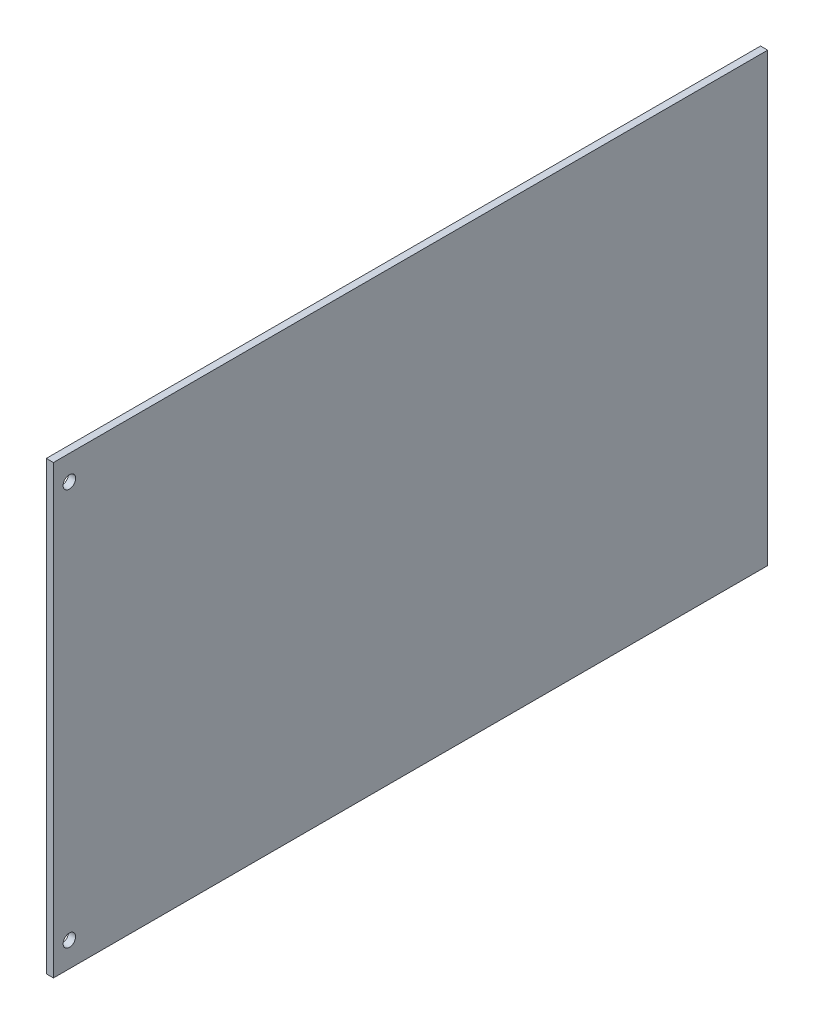
ISO-10303-21;
HEADER;
FILE_DESCRIPTION(('STEP AP214'),'2;1');
FILE_NAME('part.step','',(''),(''),'','','');
FILE_SCHEMA(('AUTOMOTIVE_DESIGN { 1 0 10303 214 1 1 1 1 }'));
ENDSEC;
DATA;
#1=APPLICATION_CONTEXT('core data for automotive mechanical design processes');
#2=APPLICATION_PROTOCOL_DEFINITION('international standard','automotive_design',2000,#1);
#3=PRODUCT_CONTEXT('',#1,'mechanical');
#4=PRODUCT('Part','Part','',(#3));
#5=PRODUCT_RELATED_PRODUCT_CATEGORY('part','',(#4));
#6=PRODUCT_DEFINITION_FORMATION('','',#4);
#7=PRODUCT_DEFINITION_CONTEXT('part definition',#1,'design');
#8=PRODUCT_DEFINITION('design','',#6,#7);
#9=PRODUCT_DEFINITION_SHAPE('','',#8);
#10=(LENGTH_UNIT() NAMED_UNIT(*) SI_UNIT(.MILLI.,.METRE.));
#11=(NAMED_UNIT(*) PLANE_ANGLE_UNIT() SI_UNIT($,.RADIAN.));
#12=(NAMED_UNIT(*) SI_UNIT($,.STERADIAN.) SOLID_ANGLE_UNIT());
#13=UNCERTAINTY_MEASURE_WITH_UNIT(LENGTH_MEASURE(1.E-05),#10,'distance_accuracy_value','');
#14=(GEOMETRIC_REPRESENTATION_CONTEXT(3) GLOBAL_UNCERTAINTY_ASSIGNED_CONTEXT((#13)) GLOBAL_UNIT_ASSIGNED_CONTEXT((#10,
#11,#12)) REPRESENTATION_CONTEXT('',''));
#15=CARTESIAN_POINT('',(0.,0.,0.));
#16=DIRECTION('',(0.,0.,1.));
#17=DIRECTION('',(1.,0.,0.));
#18=AXIS2_PLACEMENT_3D('',#15,#16,#17);
#19=CARTESIAN_POINT('',(-3.62,11.200000000001,-162.53));
#20=DIRECTION('',(1.,0.,0.));
#21=DIRECTION('',(0.,0.,-1.));
#22=AXIS2_PLACEMENT_3D('',#19,#20,#21);
#23=PLANE('',#22);
#24=CARTESIAN_POINT('',(-3.62,16.750000000001,-6.09999999999955));
#25=DIRECTION('',(-1.,0.,0.));
#26=DIRECTION('',(0.,0.,1.));
#27=AXIS2_PLACEMENT_3D('',#24,#25,#26);
#28=CIRCLE('',#27,1.4);
#29=CARTESIAN_POINT('',(-3.62,16.750000000001,-4.69999999999956));
#30=VERTEX_POINT('',#29);
#31=EDGE_CURVE('E84',#30,#30,#28,.T.);
#32=ORIENTED_EDGE('',*,*,#31,.T.);
#33=EDGE_LOOP('',(#32));
#34=FACE_BOUND('',#33,.T.);
#35=CARTESIAN_POINT('',(-3.62,105.650000000001,-6.09999999999955));
#36=DIRECTION('',(-1.,0.,0.));
#37=DIRECTION('',(0.,0.,1.));
#38=AXIS2_PLACEMENT_3D('',#35,#36,#37);
#39=CIRCLE('',#38,1.4);
#40=CARTESIAN_POINT('',(-3.62,105.650000000001,-4.69999999999956));
#41=VERTEX_POINT('',#40);
#42=EDGE_CURVE('E19',#41,#41,#39,.T.);
#43=ORIENTED_EDGE('',*,*,#42,.T.);
#44=EDGE_LOOP('',(#43));
#45=FACE_BOUND('',#44,.T.);
#46=DIRECTION('',(0.,-1.,0.));
#47=VECTOR('',#46,1.);
#48=CARTESIAN_POINT('',(-3.62,111.200000000001,-2.52999999999955));
#49=LINE('',#48,#47);
#50=CARTESIAN_POINT('',(-3.62,11.200000000001,-2.52999999999955));
#51=VERTEX_POINT('',#50);
#52=CARTESIAN_POINT('',(-3.62,111.200000000001,-2.52999999999954));
#53=VERTEX_POINT('',#52);
#54=EDGE_CURVE('E58',#51,#53,#49,.F.);
#55=ORIENTED_EDGE('',*,*,#54,.F.);
#56=DIRECTION('',(0.,0.,-1.));
#57=VECTOR('',#56,1.);
#58=CARTESIAN_POINT('',(-3.62,11.200000000001,-2.52999999999956));
#59=LINE('',#58,#57);
#60=CARTESIAN_POINT('',(-3.62,11.200000000001,-162.53));
#61=VERTEX_POINT('',#60);
#62=EDGE_CURVE('E53',#61,#51,#59,.F.);
#63=ORIENTED_EDGE('',*,*,#62,.F.);
#64=DIRECTION('',(0.,1.,0.));
#65=VECTOR('',#64,1.);
#66=CARTESIAN_POINT('',(-3.62,111.200000000001,-162.53));
#67=LINE('',#66,#65);
#68=CARTESIAN_POINT('',(-3.62,111.200000000001,-162.53));
#69=VERTEX_POINT('',#68);
#70=EDGE_CURVE('E70',#69,#61,#67,.F.);
#71=ORIENTED_EDGE('',*,*,#70,.F.);
#72=DIRECTION('',(0.,0.,1.));
#73=VECTOR('',#72,1.);
#74=CARTESIAN_POINT('',(-3.62,111.200000000001,-2.52999999999955));
#75=LINE('',#74,#73);
#76=EDGE_CURVE('E67',#53,#69,#75,.F.);
#77=ORIENTED_EDGE('',*,*,#76,.F.);
#78=EDGE_LOOP('',(#55,#63,#71,#77));
#79=FACE_BOUND('',#78,.T.);
#80=ADVANCED_FACE('F16',(#34,#45,#79),#23,.T.);
#81=CARTESIAN_POINT('',(-5.22,111.200000000001,-2.52999999999955));
#82=DIRECTION('',(0.,1.,0.));
#83=DIRECTION('',(0.,0.,1.));
#84=AXIS2_PLACEMENT_3D('',#81,#82,#83);
#85=PLANE('',#84);
#86=DIRECTION('',(0.,0.,-1.));
#87=VECTOR('',#86,1.);
#88=CARTESIAN_POINT('',(-5.22,111.200000000001,-162.53));
#89=LINE('',#88,#87);
#90=CARTESIAN_POINT('',(-5.22,111.200000000001,-162.53));
#91=VERTEX_POINT('',#90);
#92=CARTESIAN_POINT('',(-5.22,111.200000000001,-2.52999999999954));
#93=VERTEX_POINT('',#92);
#94=EDGE_CURVE('E77',#91,#93,#89,.F.);
#95=ORIENTED_EDGE('',*,*,#94,.T.);
#96=DIRECTION('',(1.,0.,0.));
#97=VECTOR('',#96,1.);
#98=CARTESIAN_POINT('',(-5.22,111.200000000001,-2.52999999999955));
#99=LINE('',#98,#97);
#100=EDGE_CURVE('E63',#53,#93,#99,.F.);
#101=ORIENTED_EDGE('',*,*,#100,.F.);
#102=ORIENTED_EDGE('',*,*,#76,.T.);
#103=DIRECTION('',(-1.,0.,0.));
#104=VECTOR('',#103,1.);
#105=CARTESIAN_POINT('',(-5.22,111.200000000001,-162.53));
#106=LINE('',#105,#104);
#107=EDGE_CURVE('E91',#91,#69,#106,.F.);
#108=ORIENTED_EDGE('',*,*,#107,.F.);
#109=EDGE_LOOP('',(#95,#101,#102,#108));
#110=FACE_BOUND('',#109,.T.);
#111=ADVANCED_FACE('F76',(#110),#85,.T.);
#112=CARTESIAN_POINT('',(-5.22,111.200000000001,-2.52999999999955));
#113=DIRECTION('',(0.,0.,1.));
#114=DIRECTION('',(0.,-1.,0.));
#115=AXIS2_PLACEMENT_3D('',#112,#113,#114);
#116=PLANE('',#115);
#117=DIRECTION('',(0.,1.,0.));
#118=VECTOR('',#117,1.);
#119=CARTESIAN_POINT('',(-5.22,11.200000000001,-2.52999999999953));
#120=LINE('',#119,#118);
#121=CARTESIAN_POINT('',(-5.22,11.200000000001,-2.52999999999955));
#122=VERTEX_POINT('',#121);
#123=EDGE_CURVE('E88',#93,#122,#120,.F.);
#124=ORIENTED_EDGE('',*,*,#123,.T.);
#125=DIRECTION('',(1.,0.,0.));
#126=VECTOR('',#125,1.);
#127=CARTESIAN_POINT('',(-5.22,11.200000000001,-2.52999999999956));
#128=LINE('',#127,#126);
#129=EDGE_CURVE('E65',#51,#122,#128,.F.);
#130=ORIENTED_EDGE('',*,*,#129,.F.);
#131=ORIENTED_EDGE('',*,*,#54,.T.);
#132=ORIENTED_EDGE('',*,*,#100,.T.);
#133=EDGE_LOOP('',(#124,#130,#131,#132));
#134=FACE_BOUND('',#133,.T.);
#135=ADVANCED_FACE('F61',(#134),#116,.T.);
#136=CARTESIAN_POINT('',(-5.22,11.200000000001,-2.52999999999956));
#137=DIRECTION('',(0.,-1.,0.));
#138=DIRECTION('',(0.,0.,-1.));
#139=AXIS2_PLACEMENT_3D('',#136,#137,#138);
#140=PLANE('',#139);
#141=DIRECTION('',(0.,0.,-1.));
#142=VECTOR('',#141,1.);
#143=CARTESIAN_POINT('',(-5.22,11.200000000001,-162.53));
#144=LINE('',#143,#142);
#145=CARTESIAN_POINT('',(-5.22,11.200000000001,-162.53));
#146=VERTEX_POINT('',#145);
#147=EDGE_CURVE('E101',#122,#146,#144,.T.);
#148=ORIENTED_EDGE('',*,*,#147,.T.);
#149=DIRECTION('',(-1.,0.,0.));
#150=VECTOR('',#149,1.);
#151=CARTESIAN_POINT('',(-5.22,11.200000000001,-162.53));
#152=LINE('',#151,#150);
#153=EDGE_CURVE('E34',#61,#146,#152,.T.);
#154=ORIENTED_EDGE('',*,*,#153,.F.);
#155=ORIENTED_EDGE('',*,*,#62,.T.);
#156=ORIENTED_EDGE('',*,*,#129,.T.);
#157=EDGE_LOOP('',(#148,#154,#155,#156));
#158=FACE_BOUND('',#157,.T.);
#159=ADVANCED_FACE('F100',(#158),#140,.T.);
#160=CARTESIAN_POINT('',(-5.22,111.200000000001,-162.53));
#161=DIRECTION('',(0.,0.,-1.));
#162=DIRECTION('',(-1.,0.,0.));
#163=AXIS2_PLACEMENT_3D('',#160,#161,#162);
#164=PLANE('',#163);
#165=DIRECTION('',(0.,1.,0.));
#166=VECTOR('',#165,1.);
#167=CARTESIAN_POINT('',(-5.22,11.200000000001,-162.53));
#168=LINE('',#167,#166);
#169=EDGE_CURVE('E83',#146,#91,#168,.T.);
#170=ORIENTED_EDGE('',*,*,#169,.T.);
#171=ORIENTED_EDGE('',*,*,#107,.T.);
#172=ORIENTED_EDGE('',*,*,#70,.T.);
#173=ORIENTED_EDGE('',*,*,#153,.T.);
#174=EDGE_LOOP('',(#170,#171,#172,#173));
#175=FACE_BOUND('',#174,.T.);
#176=ADVANCED_FACE('F106',(#175),#164,.T.);
#177=CARTESIAN_POINT('',(-5.22,105.650000000001,-6.09999999999955));
#178=DIRECTION('',(-1.,0.,0.));
#179=DIRECTION('',(0.,0.,1.));
#180=AXIS2_PLACEMENT_3D('',#177,#178,#179);
#181=CYLINDRICAL_SURFACE('',#180,1.4);
#182=ORIENTED_EDGE('',*,*,#42,.F.);
#183=EDGE_LOOP('',(#182));
#184=FACE_BOUND('',#183,.T.);
#185=CARTESIAN_POINT('',(-5.22,105.650000000001,-6.09999999999955));
#186=DIRECTION('',(-1.,0.,0.));
#187=DIRECTION('',(0.,0.,1.));
#188=AXIS2_PLACEMENT_3D('',#185,#186,#187);
#189=CIRCLE('',#188,1.4);
#190=CARTESIAN_POINT('',(-5.22,105.650000000001,-4.69999999999956));
#191=VERTEX_POINT('',#190);
#192=EDGE_CURVE('E25',#191,#191,#189,.T.);
#193=ORIENTED_EDGE('',*,*,#192,.T.);
#194=EDGE_LOOP('',(#193));
#195=FACE_BOUND('',#194,.T.);
#196=ADVANCED_FACE('F108',(#184,#195),#181,.F.);
#197=CARTESIAN_POINT('',(-5.22,16.750000000001,-6.09999999999955));
#198=DIRECTION('',(-1.,0.,0.));
#199=DIRECTION('',(0.,0.,1.));
#200=AXIS2_PLACEMENT_3D('',#197,#198,#199);
#201=CYLINDRICAL_SURFACE('',#200,1.4);
#202=ORIENTED_EDGE('',*,*,#31,.F.);
#203=EDGE_LOOP('',(#202));
#204=FACE_BOUND('',#203,.T.);
#205=CARTESIAN_POINT('',(-5.22,16.750000000001,-6.09999999999955));
#206=DIRECTION('',(-1.,0.,0.));
#207=DIRECTION('',(0.,0.,1.));
#208=AXIS2_PLACEMENT_3D('',#205,#206,#207);
#209=CIRCLE('',#208,1.4);
#210=CARTESIAN_POINT('',(-5.22,16.750000000001,-4.69999999999956));
#211=VERTEX_POINT('',#210);
#212=EDGE_CURVE('E10',#211,#211,#209,.T.);
#213=ORIENTED_EDGE('',*,*,#212,.T.);
#214=EDGE_LOOP('',(#213));
#215=FACE_BOUND('',#214,.T.);
#216=ADVANCED_FACE('F115',(#204,#215),#201,.F.);
#217=CARTESIAN_POINT('',(-5.22,11.200000000001,-162.53));
#218=DIRECTION('',(1.,0.,0.));
#219=DIRECTION('',(0.,0.,-1.));
#220=AXIS2_PLACEMENT_3D('',#217,#218,#219);
#221=PLANE('',#220);
#222=ORIENTED_EDGE('',*,*,#212,.F.);
#223=EDGE_LOOP('',(#222));
#224=FACE_BOUND('',#223,.T.);
#225=ORIENTED_EDGE('',*,*,#192,.F.);
#226=EDGE_LOOP('',(#225));
#227=FACE_BOUND('',#226,.T.);
#228=ORIENTED_EDGE('',*,*,#147,.F.);
#229=ORIENTED_EDGE('',*,*,#123,.F.);
#230=ORIENTED_EDGE('',*,*,#94,.F.);
#231=ORIENTED_EDGE('',*,*,#169,.F.);
#232=EDGE_LOOP('',(#228,#229,#230,#231));
#233=FACE_BOUND('',#232,.T.);
#234=ADVANCED_FACE('F103',(#224,#227,#233),#221,.F.);
#235=CLOSED_SHELL('',(#80,#111,#135,#159,#176,#196,#216,#234));
#236=MANIFOLD_SOLID_BREP('B1',#235);
#237=ADVANCED_BREP_SHAPE_REPRESENTATION('',(#18,#236),#14);
#238=SHAPE_DEFINITION_REPRESENTATION(#9,#237);
ENDSEC;
END-ISO-10303-21;
